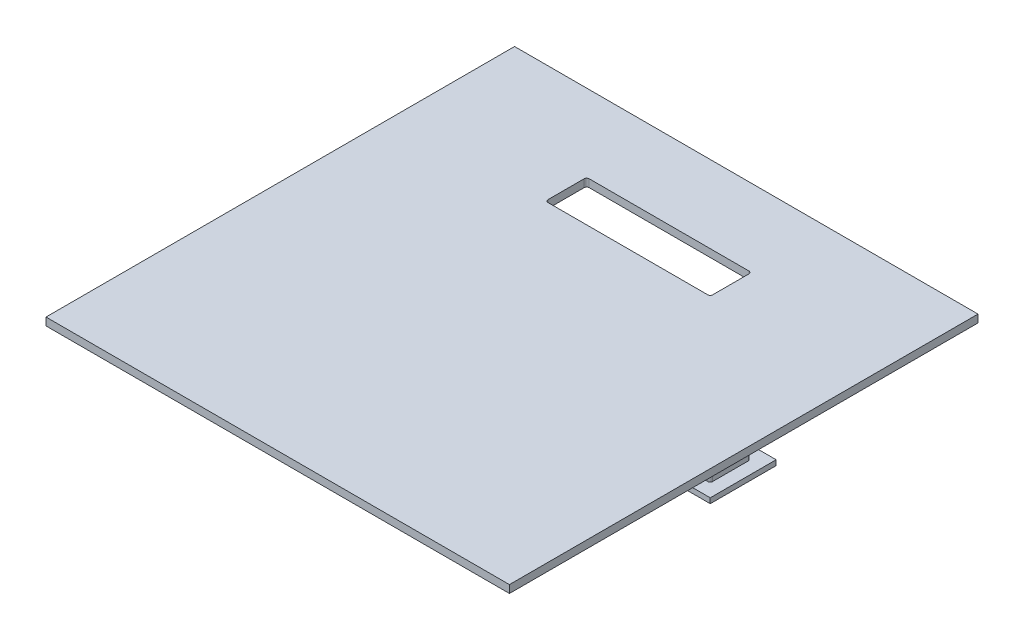
ISO-10303-21;
HEADER;
FILE_DESCRIPTION(('STEP AP214'),'2;1');
FILE_NAME('part.step','',(''),(''),'','','');
FILE_SCHEMA(('AUTOMOTIVE_DESIGN { 1 0 10303 214 1 1 1 1 }'));
ENDSEC;
DATA;
#1=APPLICATION_CONTEXT('core data for automotive mechanical design processes');
#2=APPLICATION_PROTOCOL_DEFINITION('international standard','automotive_design',2000,#1);
#3=PRODUCT_CONTEXT('',#1,'mechanical');
#4=PRODUCT('Part','Part','',(#3));
#5=PRODUCT_RELATED_PRODUCT_CATEGORY('part','',(#4));
#6=PRODUCT_DEFINITION_FORMATION('','',#4);
#7=PRODUCT_DEFINITION_CONTEXT('part definition',#1,'design');
#8=PRODUCT_DEFINITION('design','',#6,#7);
#9=PRODUCT_DEFINITION_SHAPE('','',#8);
#10=(LENGTH_UNIT() NAMED_UNIT(*) SI_UNIT(.MILLI.,.METRE.));
#11=(NAMED_UNIT(*) PLANE_ANGLE_UNIT() SI_UNIT($,.RADIAN.));
#12=(NAMED_UNIT(*) SI_UNIT($,.STERADIAN.) SOLID_ANGLE_UNIT());
#13=UNCERTAINTY_MEASURE_WITH_UNIT(LENGTH_MEASURE(1.E-05),#10,'distance_accuracy_value','');
#14=(GEOMETRIC_REPRESENTATION_CONTEXT(3) GLOBAL_UNCERTAINTY_ASSIGNED_CONTEXT((#13)) GLOBAL_UNIT_ASSIGNED_CONTEXT((#10,
#11,#12)) REPRESENTATION_CONTEXT('',''));
#15=CARTESIAN_POINT('',(0.,0.,0.));
#16=DIRECTION('',(0.,0.,1.));
#17=DIRECTION('',(1.,0.,0.));
#18=AXIS2_PLACEMENT_3D('',#15,#16,#17);
#19=CARTESIAN_POINT('',(31.,-63.,-60.));
#20=DIRECTION('',(0.,1.,0.));
#21=DIRECTION('',(0.,0.,1.));
#22=AXIS2_PLACEMENT_3D('',#19,#20,#21);
#23=CYLINDRICAL_SURFACE('',#22,0.800000000000002);
#24=CARTESIAN_POINT('',(31.,-60.,-60.));
#25=DIRECTION('',(0.,1.,0.));
#26=DIRECTION('',(0.,0.,1.));
#27=AXIS2_PLACEMENT_3D('',#24,#25,#26);
#28=CIRCLE('',#27,0.800000000000002);
#29=CARTESIAN_POINT('',(31.8,-60.,-60.));
#30=VERTEX_POINT('',#29);
#31=CARTESIAN_POINT('',(31.,-60.,-60.8));
#32=VERTEX_POINT('',#31);
#33=EDGE_CURVE('E140',#30,#32,#28,.T.);
#34=ORIENTED_EDGE('',*,*,#33,.F.);
#35=DIRECTION('',(0.,1.,0.));
#36=VECTOR('',#35,1.);
#37=CARTESIAN_POINT('',(31.8,-63.,-60.));
#38=LINE('',#37,#36);
#39=CARTESIAN_POINT('',(31.8,-63.,-60.));
#40=VERTEX_POINT('',#39);
#41=EDGE_CURVE('E12',#40,#30,#38,.T.);
#42=ORIENTED_EDGE('',*,*,#41,.F.);
#43=CARTESIAN_POINT('',(31.,-63.,-60.));
#44=DIRECTION('',(0.,1.,0.));
#45=DIRECTION('',(0.,0.,1.));
#46=AXIS2_PLACEMENT_3D('',#43,#44,#45);
#47=CIRCLE('',#46,0.800000000000002);
#48=CARTESIAN_POINT('',(31.,-63.,-60.8));
#49=VERTEX_POINT('',#48);
#50=EDGE_CURVE('E113',#40,#49,#47,.T.);
#51=ORIENTED_EDGE('',*,*,#50,.T.);
#52=DIRECTION('',(0.,1.,0.));
#53=VECTOR('',#52,1.);
#54=CARTESIAN_POINT('',(31.,-63.,-60.8));
#55=LINE('',#54,#53);
#56=EDGE_CURVE('E45',#49,#32,#55,.T.);
#57=ORIENTED_EDGE('',*,*,#56,.T.);
#58=EDGE_LOOP('',(#34,#42,#51,#57));
#59=FACE_BOUND('',#58,.T.);
#60=ADVANCED_FACE('F42',(#59),#23,.T.);
#61=CARTESIAN_POINT('',(31.8,-63.,-46.));
#62=DIRECTION('',(1.,0.,0.));
#63=DIRECTION('',(0.,0.,-1.));
#64=AXIS2_PLACEMENT_3D('',#61,#62,#63);
#65=PLANE('',#64);
#66=DIRECTION('',(0.,0.,-1.));
#67=VECTOR('',#66,1.);
#68=CARTESIAN_POINT('',(31.8,-60.,-46.));
#69=LINE('',#68,#67);
#70=CARTESIAN_POINT('',(31.8,-60.,-46.));
#71=VERTEX_POINT('',#70);
#72=EDGE_CURVE('E105',#71,#30,#69,.T.);
#73=ORIENTED_EDGE('',*,*,#72,.F.);
#74=DIRECTION('',(0.,1.,0.));
#75=VECTOR('',#74,1.);
#76=CARTESIAN_POINT('',(31.8,-63.,-46.));
#77=LINE('',#76,#75);
#78=CARTESIAN_POINT('',(31.8,-63.,-46.));
#79=VERTEX_POINT('',#78);
#80=EDGE_CURVE('E51',#79,#71,#77,.T.);
#81=ORIENTED_EDGE('',*,*,#80,.F.);
#82=DIRECTION('',(0.,0.,-1.));
#83=VECTOR('',#82,1.);
#84=CARTESIAN_POINT('',(31.8,-63.,-46.));
#85=LINE('',#84,#83);
#86=EDGE_CURVE('E131',#79,#40,#85,.T.);
#87=ORIENTED_EDGE('',*,*,#86,.T.);
#88=ORIENTED_EDGE('',*,*,#41,.T.);
#89=EDGE_LOOP('',(#73,#81,#87,#88));
#90=FACE_BOUND('',#89,.T.);
#91=ADVANCED_FACE('F110',(#90),#65,.T.);
#92=CARTESIAN_POINT('',(31.,-63.,-46.));
#93=DIRECTION('',(0.,1.,0.));
#94=DIRECTION('',(0.,0.,1.));
#95=AXIS2_PLACEMENT_3D('',#92,#93,#94);
#96=CYLINDRICAL_SURFACE('',#95,0.800000000000002);
#97=CARTESIAN_POINT('',(31.,-60.,-46.));
#98=DIRECTION('',(0.,1.,0.));
#99=DIRECTION('',(0.,0.,1.));
#100=AXIS2_PLACEMENT_3D('',#97,#98,#99);
#101=CIRCLE('',#100,0.800000000000002);
#102=CARTESIAN_POINT('',(31.,-60.,-45.2));
#103=VERTEX_POINT('',#102);
#104=EDGE_CURVE('E91',#103,#71,#101,.T.);
#105=ORIENTED_EDGE('',*,*,#104,.F.);
#106=DIRECTION('',(0.,1.,0.));
#107=VECTOR('',#106,1.);
#108=CARTESIAN_POINT('',(31.,-63.,-45.2));
#109=LINE('',#108,#107);
#110=CARTESIAN_POINT('',(31.,-63.,-45.2));
#111=VERTEX_POINT('',#110);
#112=EDGE_CURVE('E99',#111,#103,#109,.T.);
#113=ORIENTED_EDGE('',*,*,#112,.F.);
#114=CARTESIAN_POINT('',(31.,-63.,-46.));
#115=DIRECTION('',(0.,1.,0.));
#116=DIRECTION('',(0.,0.,1.));
#117=AXIS2_PLACEMENT_3D('',#114,#115,#116);
#118=CIRCLE('',#117,0.800000000000002);
#119=EDGE_CURVE('E95',#111,#79,#118,.T.);
#120=ORIENTED_EDGE('',*,*,#119,.T.);
#121=ORIENTED_EDGE('',*,*,#80,.T.);
#122=EDGE_LOOP('',(#105,#113,#120,#121));
#123=FACE_BOUND('',#122,.T.);
#124=ADVANCED_FACE('F89',(#123),#96,.T.);
#125=CARTESIAN_POINT('',(-31.,-63.,-45.2));
#126=DIRECTION('',(0.,0.,1.));
#127=DIRECTION('',(1.,0.,0.));
#128=AXIS2_PLACEMENT_3D('',#125,#126,#127);
#129=PLANE('',#128);
#130=DIRECTION('',(1.,0.,0.));
#131=VECTOR('',#130,1.);
#132=CARTESIAN_POINT('',(-31.,-60.,-45.2));
#133=LINE('',#132,#131);
#134=CARTESIAN_POINT('',(-31.,-60.,-45.2));
#135=VERTEX_POINT('',#134);
#136=EDGE_CURVE('E108',#135,#103,#133,.T.);
#137=ORIENTED_EDGE('',*,*,#136,.F.);
#138=DIRECTION('',(0.,1.,0.));
#139=VECTOR('',#138,1.);
#140=CARTESIAN_POINT('',(-31.,-63.,-45.2));
#141=LINE('',#140,#139);
#142=CARTESIAN_POINT('',(-31.,-63.,-45.2));
#143=VERTEX_POINT('',#142);
#144=EDGE_CURVE('E121',#143,#135,#141,.T.);
#145=ORIENTED_EDGE('',*,*,#144,.F.);
#146=DIRECTION('',(1.,0.,0.));
#147=VECTOR('',#146,1.);
#148=CARTESIAN_POINT('',(-31.,-63.,-45.2));
#149=LINE('',#148,#147);
#150=EDGE_CURVE('E136',#143,#111,#149,.T.);
#151=ORIENTED_EDGE('',*,*,#150,.T.);
#152=ORIENTED_EDGE('',*,*,#112,.T.);
#153=EDGE_LOOP('',(#137,#145,#151,#152));
#154=FACE_BOUND('',#153,.T.);
#155=ADVANCED_FACE('F167',(#154),#129,.T.);
#156=CARTESIAN_POINT('',(-31.,-63.,-46.));
#157=DIRECTION('',(0.,1.,0.));
#158=DIRECTION('',(0.,0.,1.));
#159=AXIS2_PLACEMENT_3D('',#156,#157,#158);
#160=CYLINDRICAL_SURFACE('',#159,0.800000000000006);
#161=CARTESIAN_POINT('',(-31.,-60.,-46.));
#162=DIRECTION('',(0.,1.,0.));
#163=DIRECTION('',(0.,0.,1.));
#164=AXIS2_PLACEMENT_3D('',#161,#162,#163);
#165=CIRCLE('',#164,0.800000000000006);
#166=CARTESIAN_POINT('',(-31.8,-60.,-46.));
#167=VERTEX_POINT('',#166);
#168=EDGE_CURVE('E152',#167,#135,#165,.T.);
#169=ORIENTED_EDGE('',*,*,#168,.F.);
#170=DIRECTION('',(0.,1.,0.));
#171=VECTOR('',#170,1.);
#172=CARTESIAN_POINT('',(-31.8,-63.,-46.));
#173=LINE('',#172,#171);
#174=CARTESIAN_POINT('',(-31.8,-63.,-46.));
#175=VERTEX_POINT('',#174);
#176=EDGE_CURVE('E123',#175,#167,#173,.T.);
#177=ORIENTED_EDGE('',*,*,#176,.F.);
#178=CARTESIAN_POINT('',(-31.,-63.,-46.));
#179=DIRECTION('',(0.,1.,0.));
#180=DIRECTION('',(0.,0.,1.));
#181=AXIS2_PLACEMENT_3D('',#178,#179,#180);
#182=CIRCLE('',#181,0.800000000000006);
#183=EDGE_CURVE('E164',#175,#143,#182,.T.);
#184=ORIENTED_EDGE('',*,*,#183,.T.);
#185=ORIENTED_EDGE('',*,*,#144,.T.);
#186=EDGE_LOOP('',(#169,#177,#184,#185));
#187=FACE_BOUND('',#186,.T.);
#188=ADVANCED_FACE('F157',(#187),#160,.T.);
#189=CARTESIAN_POINT('',(-31.8,-63.,-60.));
#190=DIRECTION('',(-1.,0.,0.));
#191=DIRECTION('',(0.,0.,1.));
#192=AXIS2_PLACEMENT_3D('',#189,#190,#191);
#193=PLANE('',#192);
#194=DIRECTION('',(0.,0.,1.));
#195=VECTOR('',#194,1.);
#196=CARTESIAN_POINT('',(-31.8,-60.,-60.));
#197=LINE('',#196,#195);
#198=CARTESIAN_POINT('',(-31.8,-60.,-60.));
#199=VERTEX_POINT('',#198);
#200=EDGE_CURVE('E149',#199,#167,#197,.T.);
#201=ORIENTED_EDGE('',*,*,#200,.F.);
#202=DIRECTION('',(0.,1.,0.));
#203=VECTOR('',#202,1.);
#204=CARTESIAN_POINT('',(-31.8,-63.,-60.));
#205=LINE('',#204,#203);
#206=CARTESIAN_POINT('',(-31.8,-63.,-60.));
#207=VERTEX_POINT('',#206);
#208=EDGE_CURVE('E125',#207,#199,#205,.T.);
#209=ORIENTED_EDGE('',*,*,#208,.F.);
#210=DIRECTION('',(0.,0.,1.));
#211=VECTOR('',#210,1.);
#212=CARTESIAN_POINT('',(-31.8,-63.,-60.));
#213=LINE('',#212,#211);
#214=EDGE_CURVE('E235',#207,#175,#213,.T.);
#215=ORIENTED_EDGE('',*,*,#214,.T.);
#216=ORIENTED_EDGE('',*,*,#176,.T.);
#217=EDGE_LOOP('',(#201,#209,#215,#216));
#218=FACE_BOUND('',#217,.T.);
#219=ADVANCED_FACE('F239',(#218),#193,.T.);
#220=CARTESIAN_POINT('',(-31.,-63.,-60.));
#221=DIRECTION('',(0.,1.,0.));
#222=DIRECTION('',(0.,0.,1.));
#223=AXIS2_PLACEMENT_3D('',#220,#221,#222);
#224=CYLINDRICAL_SURFACE('',#223,0.800000000000002);
#225=CARTESIAN_POINT('',(-31.,-60.,-60.));
#226=DIRECTION('',(0.,1.,0.));
#227=DIRECTION('',(0.,0.,1.));
#228=AXIS2_PLACEMENT_3D('',#225,#226,#227);
#229=CIRCLE('',#228,0.800000000000002);
#230=CARTESIAN_POINT('',(-31.,-60.,-60.8));
#231=VERTEX_POINT('',#230);
#232=EDGE_CURVE('E146',#231,#199,#229,.T.);
#233=ORIENTED_EDGE('',*,*,#232,.F.);
#234=DIRECTION('',(0.,1.,0.));
#235=VECTOR('',#234,1.);
#236=CARTESIAN_POINT('',(-31.,-63.,-60.8));
#237=LINE('',#236,#235);
#238=CARTESIAN_POINT('',(-31.,-63.,-60.8));
#239=VERTEX_POINT('',#238);
#240=EDGE_CURVE('E126',#239,#231,#237,.T.);
#241=ORIENTED_EDGE('',*,*,#240,.F.);
#242=CARTESIAN_POINT('',(-31.,-63.,-60.));
#243=DIRECTION('',(0.,1.,0.));
#244=DIRECTION('',(0.,0.,1.));
#245=AXIS2_PLACEMENT_3D('',#242,#243,#244);
#246=CIRCLE('',#245,0.800000000000002);
#247=EDGE_CURVE('E59',#239,#207,#246,.T.);
#248=ORIENTED_EDGE('',*,*,#247,.T.);
#249=ORIENTED_EDGE('',*,*,#208,.T.);
#250=EDGE_LOOP('',(#233,#241,#248,#249));
#251=FACE_BOUND('',#250,.T.);
#252=ADVANCED_FACE('F278',(#251),#224,.T.);
#253=CARTESIAN_POINT('',(31.,-63.,-60.8));
#254=DIRECTION('',(0.,0.,-1.));
#255=DIRECTION('',(-1.,0.,0.));
#256=AXIS2_PLACEMENT_3D('',#253,#254,#255);
#257=PLANE('',#256);
#258=DIRECTION('',(-1.,0.,0.));
#259=VECTOR('',#258,1.);
#260=CARTESIAN_POINT('',(31.,-60.,-60.8));
#261=LINE('',#260,#259);
#262=EDGE_CURVE('E142',#32,#231,#261,.T.);
#263=ORIENTED_EDGE('',*,*,#262,.F.);
#264=ORIENTED_EDGE('',*,*,#56,.F.);
#265=DIRECTION('',(-1.,0.,0.));
#266=VECTOR('',#265,1.);
#267=CARTESIAN_POINT('',(31.,-63.,-60.8));
#268=LINE('',#267,#266);
#269=EDGE_CURVE('E116',#49,#239,#268,.T.);
#270=ORIENTED_EDGE('',*,*,#269,.T.);
#271=ORIENTED_EDGE('',*,*,#240,.T.);
#272=EDGE_LOOP('',(#263,#264,#270,#271));
#273=FACE_BOUND('',#272,.T.);
#274=ADVANCED_FACE('F276',(#273),#257,.T.);
#275=CARTESIAN_POINT('',(31.,-60.,-60.));
#276=DIRECTION('',(0.,1.,0.));
#277=DIRECTION('',(0.,0.,1.));
#278=AXIS2_PLACEMENT_3D('',#275,#276,#277);
#279=PLANE('',#278);
#280=ORIENTED_EDGE('',*,*,#33,.T.);
#281=ORIENTED_EDGE('',*,*,#262,.T.);
#282=ORIENTED_EDGE('',*,*,#232,.T.);
#283=ORIENTED_EDGE('',*,*,#200,.T.);
#284=ORIENTED_EDGE('',*,*,#168,.T.);
#285=ORIENTED_EDGE('',*,*,#136,.T.);
#286=ORIENTED_EDGE('',*,*,#104,.T.);
#287=ORIENTED_EDGE('',*,*,#72,.T.);
#288=EDGE_LOOP('',(#280,#281,#282,#283,#284,#285,#286,#287));
#289=FACE_BOUND('',#288,.T.);
#290=ADVANCED_FACE('F104',(#289),#279,.T.);
#291=CARTESIAN_POINT('',(-36.8,-65.,-65.8));
#292=DIRECTION('',(1.,0.,0.));
#293=DIRECTION('',(0.,0.,-1.));
#294=AXIS2_PLACEMENT_3D('',#291,#292,#293);
#295=PLANE('',#294);
#296=DIRECTION('',(0.,0.,-1.));
#297=VECTOR('',#296,1.);
#298=CARTESIAN_POINT('',(-36.8,-63.,-65.8));
#299=LINE('',#298,#297);
#300=CARTESIAN_POINT('',(-36.8,-63.,-40.2));
#301=VERTEX_POINT('',#300);
#302=CARTESIAN_POINT('',(-36.8,-63.,-65.8));
#303=VERTEX_POINT('',#302);
#304=EDGE_CURVE('E227',#301,#303,#299,.T.);
#305=ORIENTED_EDGE('',*,*,#304,.T.);
#306=DIRECTION('',(0.,1.,0.));
#307=VECTOR('',#306,1.);
#308=CARTESIAN_POINT('',(-36.8,-65.,-65.8));
#309=LINE('',#308,#307);
#310=CARTESIAN_POINT('',(-36.8,-65.,-65.8));
#311=VERTEX_POINT('',#310);
#312=EDGE_CURVE('E143',#311,#303,#309,.T.);
#313=ORIENTED_EDGE('',*,*,#312,.F.);
#314=DIRECTION('',(0.,0.,-1.));
#315=VECTOR('',#314,1.);
#316=CARTESIAN_POINT('',(-36.8,-65.,-65.8));
#317=LINE('',#316,#315);
#318=CARTESIAN_POINT('',(-36.8,-65.,-40.2));
#319=VERTEX_POINT('',#318);
#320=EDGE_CURVE('E214',#319,#311,#317,.T.);
#321=ORIENTED_EDGE('',*,*,#320,.F.);
#322=DIRECTION('',(0.,1.,0.));
#323=VECTOR('',#322,1.);
#324=CARTESIAN_POINT('',(-36.8,-65.,-40.2));
#325=LINE('',#324,#323);
#326=EDGE_CURVE('E256',#319,#301,#325,.T.);
#327=ORIENTED_EDGE('',*,*,#326,.T.);
#328=EDGE_LOOP('',(#305,#313,#321,#327));
#329=FACE_BOUND('',#328,.T.);
#330=ADVANCED_FACE('F225',(#329),#295,.F.);
#331=CARTESIAN_POINT('',(36.8,-65.,-65.8));
#332=DIRECTION('',(0.,0.,1.));
#333=DIRECTION('',(1.,0.,0.));
#334=AXIS2_PLACEMENT_3D('',#331,#332,#333);
#335=PLANE('',#334);
#336=DIRECTION('',(1.,0.,0.));
#337=VECTOR('',#336,1.);
#338=CARTESIAN_POINT('',(36.8,-63.,-65.8));
#339=LINE('',#338,#337);
#340=CARTESIAN_POINT('',(36.8,-63.,-65.8));
#341=VERTEX_POINT('',#340);
#342=EDGE_CURVE('E247',#303,#341,#339,.T.);
#343=ORIENTED_EDGE('',*,*,#342,.T.);
#344=DIRECTION('',(0.,1.,0.));
#345=VECTOR('',#344,1.);
#346=CARTESIAN_POINT('',(36.8,-65.,-65.8));
#347=LINE('',#346,#345);
#348=CARTESIAN_POINT('',(36.8,-65.,-65.8));
#349=VERTEX_POINT('',#348);
#350=EDGE_CURVE('E210',#349,#341,#347,.T.);
#351=ORIENTED_EDGE('',*,*,#350,.F.);
#352=DIRECTION('',(1.,0.,0.));
#353=VECTOR('',#352,1.);
#354=CARTESIAN_POINT('',(36.8,-65.,-65.8));
#355=LINE('',#354,#353);
#356=EDGE_CURVE('E204',#311,#349,#355,.T.);
#357=ORIENTED_EDGE('',*,*,#356,.F.);
#358=ORIENTED_EDGE('',*,*,#312,.T.);
#359=EDGE_LOOP('',(#343,#351,#357,#358));
#360=FACE_BOUND('',#359,.T.);
#361=ADVANCED_FACE('F206',(#360),#335,.F.);
#362=CARTESIAN_POINT('',(36.8,-65.,-65.8));
#363=DIRECTION('',(-1.,0.,0.));
#364=DIRECTION('',(0.,0.,1.));
#365=AXIS2_PLACEMENT_3D('',#362,#363,#364);
#366=PLANE('',#365);
#367=DIRECTION('',(0.,0.,1.));
#368=VECTOR('',#367,1.);
#369=CARTESIAN_POINT('',(36.8,-63.,-65.8));
#370=LINE('',#369,#368);
#371=CARTESIAN_POINT('',(36.8,-63.,-40.2));
#372=VERTEX_POINT('',#371);
#373=EDGE_CURVE('E249',#341,#372,#370,.T.);
#374=ORIENTED_EDGE('',*,*,#373,.T.);
#375=DIRECTION('',(0.,1.,0.));
#376=VECTOR('',#375,1.);
#377=CARTESIAN_POINT('',(36.8,-65.,-40.2));
#378=LINE('',#377,#376);
#379=CARTESIAN_POINT('',(36.8,-65.,-40.2));
#380=VERTEX_POINT('',#379);
#381=EDGE_CURVE('E229',#380,#372,#378,.T.);
#382=ORIENTED_EDGE('',*,*,#381,.F.);
#383=DIRECTION('',(0.,0.,1.));
#384=VECTOR('',#383,1.);
#385=CARTESIAN_POINT('',(36.8,-65.,-65.8));
#386=LINE('',#385,#384);
#387=EDGE_CURVE('E213',#349,#380,#386,.T.);
#388=ORIENTED_EDGE('',*,*,#387,.F.);
#389=ORIENTED_EDGE('',*,*,#350,.T.);
#390=EDGE_LOOP('',(#374,#382,#388,#389));
#391=FACE_BOUND('',#390,.T.);
#392=ADVANCED_FACE('F262',(#391),#366,.F.);
#393=CARTESIAN_POINT('',(36.8,-65.,-40.2));
#394=DIRECTION('',(0.,0.,-1.));
#395=DIRECTION('',(-1.,0.,0.));
#396=AXIS2_PLACEMENT_3D('',#393,#394,#395);
#397=PLANE('',#396);
#398=DIRECTION('',(-1.,0.,0.));
#399=VECTOR('',#398,1.);
#400=CARTESIAN_POINT('',(36.8,-63.,-40.2));
#401=LINE('',#400,#399);
#402=EDGE_CURVE('E223',#372,#301,#401,.T.);
#403=ORIENTED_EDGE('',*,*,#402,.T.);
#404=ORIENTED_EDGE('',*,*,#326,.F.);
#405=DIRECTION('',(-1.,0.,0.));
#406=VECTOR('',#405,1.);
#407=CARTESIAN_POINT('',(36.8,-65.,-40.2));
#408=LINE('',#407,#406);
#409=EDGE_CURVE('E219',#380,#319,#408,.T.);
#410=ORIENTED_EDGE('',*,*,#409,.F.);
#411=ORIENTED_EDGE('',*,*,#381,.T.);
#412=EDGE_LOOP('',(#403,#404,#410,#411));
#413=FACE_BOUND('',#412,.T.);
#414=ADVANCED_FACE('F260',(#413),#397,.F.);
#415=CARTESIAN_POINT('',(-36.8,-65.,-40.2));
#416=DIRECTION('',(0.,-1.,0.));
#417=DIRECTION('',(0.,0.,-1.));
#418=AXIS2_PLACEMENT_3D('',#415,#416,#417);
#419=PLANE('',#418);
#420=ORIENTED_EDGE('',*,*,#320,.T.);
#421=ORIENTED_EDGE('',*,*,#356,.T.);
#422=ORIENTED_EDGE('',*,*,#387,.T.);
#423=ORIENTED_EDGE('',*,*,#409,.T.);
#424=EDGE_LOOP('',(#420,#421,#422,#423));
#425=FACE_BOUND('',#424,.T.);
#426=ADVANCED_FACE('F217',(#425),#419,.T.);
#427=CARTESIAN_POINT('',(-36.8,-63.,-40.2));
#428=DIRECTION('',(0.,-1.,0.));
#429=DIRECTION('',(0.,0.,-1.));
#430=AXIS2_PLACEMENT_3D('',#427,#428,#429);
#431=PLANE('',#430);
#432=ORIENTED_EDGE('',*,*,#50,.F.);
#433=ORIENTED_EDGE('',*,*,#86,.F.);
#434=ORIENTED_EDGE('',*,*,#119,.F.);
#435=ORIENTED_EDGE('',*,*,#150,.F.);
#436=ORIENTED_EDGE('',*,*,#183,.F.);
#437=ORIENTED_EDGE('',*,*,#214,.F.);
#438=ORIENTED_EDGE('',*,*,#247,.F.);
#439=ORIENTED_EDGE('',*,*,#269,.F.);
#440=EDGE_LOOP('',(#432,#433,#434,#435,#436,#437,#438,#439));
#441=FACE_BOUND('',#440,.T.);
#442=ORIENTED_EDGE('',*,*,#304,.F.);
#443=ORIENTED_EDGE('',*,*,#402,.F.);
#444=ORIENTED_EDGE('',*,*,#373,.F.);
#445=ORIENTED_EDGE('',*,*,#342,.F.);
#446=EDGE_LOOP('',(#442,#443,#444,#445));
#447=FACE_BOUND('',#446,.T.);
#448=ADVANCED_FACE('F241',(#441,#447),#431,.F.);
#449=CLOSED_SHELL('',(#60,#91,#124,#155,#188,#219,#252,#274,#290,#330,#361,#392,#414,#426,#448));
#450=MANIFOLD_SOLID_BREP('B2',#449);
#451=CARTESIAN_POINT('',(-90.,-3.,91.));
#452=DIRECTION('',(-1.,0.,0.));
#453=DIRECTION('',(0.,0.,1.));
#454=AXIS2_PLACEMENT_3D('',#451,#452,#453);
#455=PLANE('',#454);
#456=DIRECTION('',(0.,0.,1.));
#457=VECTOR('',#456,1.);
#458=CARTESIAN_POINT('',(-90.,0.,91.));
#459=LINE('',#458,#457);
#460=CARTESIAN_POINT('',(-90.,0.,-91.));
#461=VERTEX_POINT('',#460);
#462=CARTESIAN_POINT('',(-90.,0.,91.));
#463=VERTEX_POINT('',#462);
#464=EDGE_CURVE('E509',#461,#463,#459,.T.);
#465=ORIENTED_EDGE('',*,*,#464,.F.);
#466=DIRECTION('',(0.,1.,0.));
#467=VECTOR('',#466,1.);
#468=CARTESIAN_POINT('',(-90.,-3.,-91.));
#469=LINE('',#468,#467);
#470=CARTESIAN_POINT('',(-90.,-3.,-91.));
#471=VERTEX_POINT('',#470);
#472=EDGE_CURVE('E497',#471,#461,#469,.T.);
#473=ORIENTED_EDGE('',*,*,#472,.F.);
#474=DIRECTION('',(0.,0.,1.));
#475=VECTOR('',#474,1.);
#476=CARTESIAN_POINT('',(-90.,-3.,91.));
#477=LINE('',#476,#475);
#478=CARTESIAN_POINT('',(-90.,-3.,91.));
#479=VERTEX_POINT('',#478);
#480=EDGE_CURVE('E492',#471,#479,#477,.T.);
#481=ORIENTED_EDGE('',*,*,#480,.T.);
#482=DIRECTION('',(0.,1.,0.));
#483=VECTOR('',#482,1.);
#484=CARTESIAN_POINT('',(-90.,-3.,91.));
#485=LINE('',#484,#483);
#486=EDGE_CURVE('E474',#479,#463,#485,.T.);
#487=ORIENTED_EDGE('',*,*,#486,.T.);
#488=EDGE_LOOP('',(#465,#473,#481,#487));
#489=FACE_BOUND('',#488,.T.);
#490=ADVANCED_FACE('F384',(#489),#455,.T.);
#491=CARTESIAN_POINT('',(90.,-3.,-91.));
#492=DIRECTION('',(0.,0.,-1.));
#493=DIRECTION('',(-1.,0.,0.));
#494=AXIS2_PLACEMENT_3D('',#491,#492,#493);
#495=PLANE('',#494);
#496=DIRECTION('',(-1.,0.,0.));
#497=VECTOR('',#496,1.);
#498=CARTESIAN_POINT('',(90.,0.,-91.));
#499=LINE('',#498,#497);
#500=CARTESIAN_POINT('',(90.,0.,-91.));
#501=VERTEX_POINT('',#500);
#502=EDGE_CURVE('E498',#501,#461,#499,.T.);
#503=ORIENTED_EDGE('',*,*,#502,.F.);
#504=DIRECTION('',(0.,1.,0.));
#505=VECTOR('',#504,1.);
#506=CARTESIAN_POINT('',(90.,-3.,-91.));
#507=LINE('',#506,#505);
#508=CARTESIAN_POINT('',(90.,-3.,-91.));
#509=VERTEX_POINT('',#508);
#510=EDGE_CURVE('E516',#509,#501,#507,.T.);
#511=ORIENTED_EDGE('',*,*,#510,.F.);
#512=DIRECTION('',(-1.,0.,0.));
#513=VECTOR('',#512,1.);
#514=CARTESIAN_POINT('',(90.,-3.,-91.));
#515=LINE('',#514,#513);
#516=EDGE_CURVE('E485',#509,#471,#515,.T.);
#517=ORIENTED_EDGE('',*,*,#516,.T.);
#518=ORIENTED_EDGE('',*,*,#472,.T.);
#519=EDGE_LOOP('',(#503,#511,#517,#518));
#520=FACE_BOUND('',#519,.T.);
#521=ADVANCED_FACE('F606',(#520),#495,.T.);
#522=CARTESIAN_POINT('',(90.,-3.,91.));
#523=DIRECTION('',(1.,0.,0.));
#524=DIRECTION('',(0.,0.,-1.));
#525=AXIS2_PLACEMENT_3D('',#522,#523,#524);
#526=PLANE('',#525);
#527=DIRECTION('',(0.,0.,-1.));
#528=VECTOR('',#527,1.);
#529=CARTESIAN_POINT('',(90.,0.,91.));
#530=LINE('',#529,#528);
#531=CARTESIAN_POINT('',(90.,0.,91.));
#532=VERTEX_POINT('',#531);
#533=EDGE_CURVE('E501',#532,#501,#530,.T.);
#534=ORIENTED_EDGE('',*,*,#533,.F.);
#535=DIRECTION('',(0.,1.,0.));
#536=VECTOR('',#535,1.);
#537=CARTESIAN_POINT('',(90.,-3.,91.));
#538=LINE('',#537,#536);
#539=CARTESIAN_POINT('',(90.,-3.,91.));
#540=VERTEX_POINT('',#539);
#541=EDGE_CURVE('E484',#540,#532,#538,.T.);
#542=ORIENTED_EDGE('',*,*,#541,.F.);
#543=DIRECTION('',(0.,0.,-1.));
#544=VECTOR('',#543,1.);
#545=CARTESIAN_POINT('',(90.,-3.,91.));
#546=LINE('',#545,#544);
#547=EDGE_CURVE('E495',#540,#509,#546,.T.);
#548=ORIENTED_EDGE('',*,*,#547,.T.);
#549=ORIENTED_EDGE('',*,*,#510,.T.);
#550=EDGE_LOOP('',(#534,#542,#548,#549));
#551=FACE_BOUND('',#550,.T.);
#552=ADVANCED_FACE('F611',(#551),#526,.T.);
#553=CARTESIAN_POINT('',(90.,-3.,91.));
#554=DIRECTION('',(0.,0.,1.));
#555=DIRECTION('',(1.,0.,0.));
#556=AXIS2_PLACEMENT_3D('',#553,#554,#555);
#557=PLANE('',#556);
#558=DIRECTION('',(1.,0.,0.));
#559=VECTOR('',#558,1.);
#560=CARTESIAN_POINT('',(90.,0.,91.));
#561=LINE('',#560,#559);
#562=EDGE_CURVE('E479',#463,#532,#561,.T.);
#563=ORIENTED_EDGE('',*,*,#562,.F.);
#564=ORIENTED_EDGE('',*,*,#486,.F.);
#565=DIRECTION('',(1.,0.,0.));
#566=VECTOR('',#565,1.);
#567=CARTESIAN_POINT('',(90.,-3.,91.));
#568=LINE('',#567,#566);
#569=EDGE_CURVE('E477',#479,#540,#568,.T.);
#570=ORIENTED_EDGE('',*,*,#569,.T.);
#571=ORIENTED_EDGE('',*,*,#541,.T.);
#572=EDGE_LOOP('',(#563,#564,#570,#571));
#573=FACE_BOUND('',#572,.T.);
#574=ADVANCED_FACE('F476',(#573),#557,.T.);
#575=CARTESIAN_POINT('',(-90.,-3.,-91.));
#576=DIRECTION('',(0.,1.,0.));
#577=DIRECTION('',(0.,0.,1.));
#578=AXIS2_PLACEMENT_3D('',#575,#576,#577);
#579=PLANE('',#578);
#580=DIRECTION('',(0.,0.,-1.));
#581=VECTOR('',#580,1.);
#582=CARTESIAN_POINT('',(32.,-3.,-91.));
#583=LINE('',#582,#581);
#584=CARTESIAN_POINT('',(32.,-3.,-46.));
#585=VERTEX_POINT('',#584);
#586=CARTESIAN_POINT('',(32.,-3.,-60.));
#587=VERTEX_POINT('',#586);
#588=EDGE_CURVE('E570',#585,#587,#583,.T.);
#589=ORIENTED_EDGE('',*,*,#588,.T.);
#590=CARTESIAN_POINT('',(31.,-3.,-60.));
#591=DIRECTION('',(0.,1.,0.));
#592=DIRECTION('',(0.,0.,1.));
#593=AXIS2_PLACEMENT_3D('',#590,#591,#592);
#594=CIRCLE('',#593,1.);
#595=CARTESIAN_POINT('',(31.,-3.,-61.));
#596=VERTEX_POINT('',#595);
#597=EDGE_CURVE('E406',#587,#596,#594,.T.);
#598=ORIENTED_EDGE('',*,*,#597,.T.);
#599=DIRECTION('',(-1.,0.,0.));
#600=VECTOR('',#599,1.);
#601=CARTESIAN_POINT('',(-90.,-3.,-61.));
#602=LINE('',#601,#600);
#603=CARTESIAN_POINT('',(-31.,-3.,-61.));
#604=VERTEX_POINT('',#603);
#605=EDGE_CURVE('E566',#596,#604,#602,.T.);
#606=ORIENTED_EDGE('',*,*,#605,.T.);
#607=CARTESIAN_POINT('',(-31.,-3.,-60.));
#608=DIRECTION('',(0.,1.,0.));
#609=DIRECTION('',(0.,0.,1.));
#610=AXIS2_PLACEMENT_3D('',#607,#608,#609);
#611=CIRCLE('',#610,1.);
#612=CARTESIAN_POINT('',(-32.,-3.,-60.));
#613=VERTEX_POINT('',#612);
#614=EDGE_CURVE('E40',#604,#613,#611,.T.);
#615=ORIENTED_EDGE('',*,*,#614,.T.);
#616=DIRECTION('',(0.,0.,1.));
#617=VECTOR('',#616,1.);
#618=CARTESIAN_POINT('',(-32.,-3.,-91.));
#619=LINE('',#618,#617);
#620=CARTESIAN_POINT('',(-32.,-3.,-46.));
#621=VERTEX_POINT('',#620);
#622=EDGE_CURVE('E504',#613,#621,#619,.T.);
#623=ORIENTED_EDGE('',*,*,#622,.T.);
#624=CARTESIAN_POINT('',(-31.,-3.,-46.));
#625=DIRECTION('',(0.,1.,0.));
#626=DIRECTION('',(0.,0.,1.));
#627=AXIS2_PLACEMENT_3D('',#624,#625,#626);
#628=CIRCLE('',#627,1.);
#629=CARTESIAN_POINT('',(-31.,-3.,-45.));
#630=VERTEX_POINT('',#629);
#631=EDGE_CURVE('E539',#621,#630,#628,.T.);
#632=ORIENTED_EDGE('',*,*,#631,.T.);
#633=DIRECTION('',(1.,0.,0.));
#634=VECTOR('',#633,1.);
#635=CARTESIAN_POINT('',(-90.,-3.,-45.));
#636=LINE('',#635,#634);
#637=CARTESIAN_POINT('',(31.,-3.,-45.));
#638=VERTEX_POINT('',#637);
#639=EDGE_CURVE('E559',#630,#638,#636,.T.);
#640=ORIENTED_EDGE('',*,*,#639,.T.);
#641=CARTESIAN_POINT('',(31.,-3.,-46.));
#642=DIRECTION('',(0.,1.,0.));
#643=DIRECTION('',(0.,0.,1.));
#644=AXIS2_PLACEMENT_3D('',#641,#642,#643);
#645=CIRCLE('',#644,1.);
#646=EDGE_CURVE('E543',#638,#585,#645,.T.);
#647=ORIENTED_EDGE('',*,*,#646,.T.);
#648=EDGE_LOOP('',(#589,#598,#606,#615,#623,#632,#640,#647));
#649=FACE_BOUND('',#648,.T.);
#650=ORIENTED_EDGE('',*,*,#480,.F.);
#651=ORIENTED_EDGE('',*,*,#516,.F.);
#652=ORIENTED_EDGE('',*,*,#547,.F.);
#653=ORIENTED_EDGE('',*,*,#569,.F.);
#654=EDGE_LOOP('',(#650,#651,#652,#653));
#655=FACE_BOUND('',#654,.T.);
#656=ADVANCED_FACE('F490',(#649,#655),#579,.F.);
#657=CARTESIAN_POINT('',(-90.,0.,-91.));
#658=DIRECTION('',(0.,1.,0.));
#659=DIRECTION('',(0.,0.,1.));
#660=AXIS2_PLACEMENT_3D('',#657,#658,#659);
#661=PLANE('',#660);
#662=DIRECTION('',(0.,0.,1.));
#663=VECTOR('',#662,1.);
#664=CARTESIAN_POINT('',(-32.,0.,-45.));
#665=LINE('',#664,#663);
#666=CARTESIAN_POINT('',(-32.,0.,-60.));
#667=VERTEX_POINT('',#666);
#668=CARTESIAN_POINT('',(-32.,0.,-46.));
#669=VERTEX_POINT('',#668);
#670=EDGE_CURVE('E554',#667,#669,#665,.T.);
#671=ORIENTED_EDGE('',*,*,#670,.F.);
#672=CARTESIAN_POINT('',(-31.,0.,-60.));
#673=DIRECTION('',(0.,1.,0.));
#674=DIRECTION('',(0.,0.,1.));
#675=AXIS2_PLACEMENT_3D('',#672,#673,#674);
#676=CIRCLE('',#675,1.);
#677=CARTESIAN_POINT('',(-31.,0.,-61.));
#678=VERTEX_POINT('',#677);
#679=EDGE_CURVE('E392',#667,#678,#676,.F.);
#680=ORIENTED_EDGE('',*,*,#679,.T.);
#681=DIRECTION('',(-1.,0.,0.));
#682=VECTOR('',#681,1.);
#683=CARTESIAN_POINT('',(32.,0.,-61.));
#684=LINE('',#683,#682);
#685=CARTESIAN_POINT('',(31.,0.,-61.));
#686=VERTEX_POINT('',#685);
#687=EDGE_CURVE('E552',#686,#678,#684,.T.);
#688=ORIENTED_EDGE('',*,*,#687,.F.);
#689=CARTESIAN_POINT('',(31.,0.,-60.));
#690=DIRECTION('',(0.,1.,0.));
#691=DIRECTION('',(0.,0.,1.));
#692=AXIS2_PLACEMENT_3D('',#689,#690,#691);
#693=CIRCLE('',#692,1.);
#694=CARTESIAN_POINT('',(32.,0.,-60.));
#695=VERTEX_POINT('',#694);
#696=EDGE_CURVE('E545',#686,#695,#693,.F.);
#697=ORIENTED_EDGE('',*,*,#696,.T.);
#698=DIRECTION('',(0.,0.,-1.));
#699=VECTOR('',#698,1.);
#700=CARTESIAN_POINT('',(32.,0.,-45.));
#701=LINE('',#700,#699);
#702=CARTESIAN_POINT('',(32.,0.,-46.));
#703=VERTEX_POINT('',#702);
#704=EDGE_CURVE('E560',#703,#695,#701,.T.);
#705=ORIENTED_EDGE('',*,*,#704,.F.);
#706=CARTESIAN_POINT('',(31.,0.,-46.));
#707=DIRECTION('',(0.,1.,0.));
#708=DIRECTION('',(0.,0.,1.));
#709=AXIS2_PLACEMENT_3D('',#706,#707,#708);
#710=CIRCLE('',#709,1.);
#711=CARTESIAN_POINT('',(31.,0.,-45.));
#712=VERTEX_POINT('',#711);
#713=EDGE_CURVE('E541',#703,#712,#710,.F.);
#714=ORIENTED_EDGE('',*,*,#713,.T.);
#715=DIRECTION('',(1.,0.,0.));
#716=VECTOR('',#715,1.);
#717=CARTESIAN_POINT('',(32.,0.,-45.));
#718=LINE('',#717,#716);
#719=CARTESIAN_POINT('',(-31.,0.,-45.));
#720=VERTEX_POINT('',#719);
#721=EDGE_CURVE('E577',#720,#712,#718,.T.);
#722=ORIENTED_EDGE('',*,*,#721,.F.);
#723=CARTESIAN_POINT('',(-31.,0.,-46.));
#724=DIRECTION('',(0.,1.,0.));
#725=DIRECTION('',(0.,0.,1.));
#726=AXIS2_PLACEMENT_3D('',#723,#724,#725);
#727=CIRCLE('',#726,1.);
#728=EDGE_CURVE('E537',#720,#669,#727,.F.);
#729=ORIENTED_EDGE('',*,*,#728,.T.);
#730=EDGE_LOOP('',(#671,#680,#688,#697,#705,#714,#722,#729));
#731=FACE_BOUND('',#730,.T.);
#732=ORIENTED_EDGE('',*,*,#464,.T.);
#733=ORIENTED_EDGE('',*,*,#562,.T.);
#734=ORIENTED_EDGE('',*,*,#533,.T.);
#735=ORIENTED_EDGE('',*,*,#502,.T.);
#736=EDGE_LOOP('',(#732,#733,#734,#735));
#737=FACE_BOUND('',#736,.T.);
#738=ADVANCED_FACE('F550',(#731,#737),#661,.T.);
#739=CARTESIAN_POINT('',(-32.,-10.,-45.));
#740=DIRECTION('',(-1.,0.,0.));
#741=DIRECTION('',(0.,0.,1.));
#742=AXIS2_PLACEMENT_3D('',#739,#740,#741);
#743=PLANE('',#742);
#744=ORIENTED_EDGE('',*,*,#670,.T.);
#745=DIRECTION('',(0.,1.,0.));
#746=VECTOR('',#745,1.);
#747=CARTESIAN_POINT('',(-32.,-3.,-46.));
#748=LINE('',#747,#746);
#749=EDGE_CURVE('E526',#669,#621,#748,.F.);
#750=ORIENTED_EDGE('',*,*,#749,.T.);
#751=ORIENTED_EDGE('',*,*,#622,.F.);
#752=DIRECTION('',(0.,1.,0.));
#753=VECTOR('',#752,1.);
#754=CARTESIAN_POINT('',(-32.,0.,-60.));
#755=LINE('',#754,#753);
#756=EDGE_CURVE('E523',#613,#667,#755,.T.);
#757=ORIENTED_EDGE('',*,*,#756,.T.);
#758=EDGE_LOOP('',(#744,#750,#751,#757));
#759=FACE_BOUND('',#758,.T.);
#760=ADVANCED_FACE('F568',(#759),#743,.F.);
#761=CARTESIAN_POINT('',(32.,-10.,-61.));
#762=DIRECTION('',(0.,0.,-1.));
#763=DIRECTION('',(-1.,0.,0.));
#764=AXIS2_PLACEMENT_3D('',#761,#762,#763);
#765=PLANE('',#764);
#766=ORIENTED_EDGE('',*,*,#605,.F.);
#767=DIRECTION('',(0.,1.,0.));
#768=VECTOR('',#767,1.);
#769=CARTESIAN_POINT('',(31.,0.,-61.));
#770=LINE('',#769,#768);
#771=EDGE_CURVE('E534',#596,#686,#770,.T.);
#772=ORIENTED_EDGE('',*,*,#771,.T.);
#773=ORIENTED_EDGE('',*,*,#687,.T.);
#774=DIRECTION('',(0.,1.,0.));
#775=VECTOR('',#774,1.);
#776=CARTESIAN_POINT('',(-31.,-3.,-61.));
#777=LINE('',#776,#775);
#778=EDGE_CURVE('E399',#678,#604,#777,.F.);
#779=ORIENTED_EDGE('',*,*,#778,.T.);
#780=EDGE_LOOP('',(#766,#772,#773,#779));
#781=FACE_BOUND('',#780,.T.);
#782=ADVANCED_FACE('F557',(#781),#765,.F.);
#783=CARTESIAN_POINT('',(32.,-10.,-45.));
#784=DIRECTION('',(1.,0.,0.));
#785=DIRECTION('',(0.,0.,-1.));
#786=AXIS2_PLACEMENT_3D('',#783,#784,#785);
#787=PLANE('',#786);
#788=ORIENTED_EDGE('',*,*,#588,.F.);
#789=DIRECTION('',(0.,1.,0.));
#790=VECTOR('',#789,1.);
#791=CARTESIAN_POINT('',(32.,0.,-46.));
#792=LINE('',#791,#790);
#793=EDGE_CURVE('E530',#585,#703,#792,.T.);
#794=ORIENTED_EDGE('',*,*,#793,.T.);
#795=ORIENTED_EDGE('',*,*,#704,.T.);
#796=DIRECTION('',(0.,1.,0.));
#797=VECTOR('',#796,1.);
#798=CARTESIAN_POINT('',(32.,-3.,-60.));
#799=LINE('',#798,#797);
#800=EDGE_CURVE('E528',#695,#587,#799,.F.);
#801=ORIENTED_EDGE('',*,*,#800,.T.);
#802=EDGE_LOOP('',(#788,#794,#795,#801));
#803=FACE_BOUND('',#802,.T.);
#804=ADVANCED_FACE('F594',(#803),#787,.F.);
#805=CARTESIAN_POINT('',(32.,-10.,-45.));
#806=DIRECTION('',(0.,0.,1.));
#807=DIRECTION('',(1.,0.,0.));
#808=AXIS2_PLACEMENT_3D('',#805,#806,#807);
#809=PLANE('',#808);
#810=ORIENTED_EDGE('',*,*,#639,.F.);
#811=DIRECTION('',(0.,1.,0.));
#812=VECTOR('',#811,1.);
#813=CARTESIAN_POINT('',(-31.,0.,-45.));
#814=LINE('',#813,#812);
#815=EDGE_CURVE('E520',#630,#720,#814,.T.);
#816=ORIENTED_EDGE('',*,*,#815,.T.);
#817=ORIENTED_EDGE('',*,*,#721,.T.);
#818=DIRECTION('',(0.,1.,0.));
#819=VECTOR('',#818,1.);
#820=CARTESIAN_POINT('',(31.,-3.,-45.));
#821=LINE('',#820,#819);
#822=EDGE_CURVE('E515',#712,#638,#821,.F.);
#823=ORIENTED_EDGE('',*,*,#822,.T.);
#824=EDGE_LOOP('',(#810,#816,#817,#823));
#825=FACE_BOUND('',#824,.T.);
#826=ADVANCED_FACE('F586',(#825),#809,.F.);
#827=CARTESIAN_POINT('',(-31.,-10.,-46.));
#828=DIRECTION('',(0.,-1.,0.));
#829=DIRECTION('',(0.,0.,-1.));
#830=AXIS2_PLACEMENT_3D('',#827,#828,#829);
#831=CYLINDRICAL_SURFACE('',#830,1.);
#832=ORIENTED_EDGE('',*,*,#631,.F.);
#833=ORIENTED_EDGE('',*,*,#749,.F.);
#834=ORIENTED_EDGE('',*,*,#728,.F.);
#835=ORIENTED_EDGE('',*,*,#815,.F.);
#836=EDGE_LOOP('',(#832,#833,#834,#835));
#837=FACE_BOUND('',#836,.T.);
#838=ADVANCED_FACE('F581',(#837),#831,.F.);
#839=CARTESIAN_POINT('',(31.,-10.,-46.));
#840=DIRECTION('',(0.,-1.,0.));
#841=DIRECTION('',(0.,0.,-1.));
#842=AXIS2_PLACEMENT_3D('',#839,#840,#841);
#843=CYLINDRICAL_SURFACE('',#842,1.);
#844=ORIENTED_EDGE('',*,*,#646,.F.);
#845=ORIENTED_EDGE('',*,*,#822,.F.);
#846=ORIENTED_EDGE('',*,*,#713,.F.);
#847=ORIENTED_EDGE('',*,*,#793,.F.);
#848=EDGE_LOOP('',(#844,#845,#846,#847));
#849=FACE_BOUND('',#848,.T.);
#850=ADVANCED_FACE('F590',(#849),#843,.F.);
#851=CARTESIAN_POINT('',(31.,-10.,-60.));
#852=DIRECTION('',(0.,-1.,0.));
#853=DIRECTION('',(0.,0.,-1.));
#854=AXIS2_PLACEMENT_3D('',#851,#852,#853);
#855=CYLINDRICAL_SURFACE('',#854,1.);
#856=ORIENTED_EDGE('',*,*,#597,.F.);
#857=ORIENTED_EDGE('',*,*,#800,.F.);
#858=ORIENTED_EDGE('',*,*,#696,.F.);
#859=ORIENTED_EDGE('',*,*,#771,.F.);
#860=EDGE_LOOP('',(#856,#857,#858,#859));
#861=FACE_BOUND('',#860,.T.);
#862=ADVANCED_FACE('F598',(#861),#855,.F.);
#863=CARTESIAN_POINT('',(-31.,-10.,-60.));
#864=DIRECTION('',(0.,-1.,0.));
#865=DIRECTION('',(0.,0.,-1.));
#866=AXIS2_PLACEMENT_3D('',#863,#864,#865);
#867=CYLINDRICAL_SURFACE('',#866,1.);
#868=ORIENTED_EDGE('',*,*,#614,.F.);
#869=ORIENTED_EDGE('',*,*,#778,.F.);
#870=ORIENTED_EDGE('',*,*,#679,.F.);
#871=ORIENTED_EDGE('',*,*,#756,.F.);
#872=EDGE_LOOP('',(#868,#869,#870,#871));
#873=FACE_BOUND('',#872,.T.);
#874=ADVANCED_FACE('F386',(#873),#867,.F.);
#875=CLOSED_SHELL('',(#490,#521,#552,#574,#656,#738,#760,#782,#804,#826,#838,#850,#862,#874));
#876=MANIFOLD_SOLID_BREP('B6',#875);
#877=ADVANCED_BREP_SHAPE_REPRESENTATION('',(#18,#450,#876),#14);
#878=SHAPE_DEFINITION_REPRESENTATION(#9,#877);
ENDSEC;
END-ISO-10303-21;
